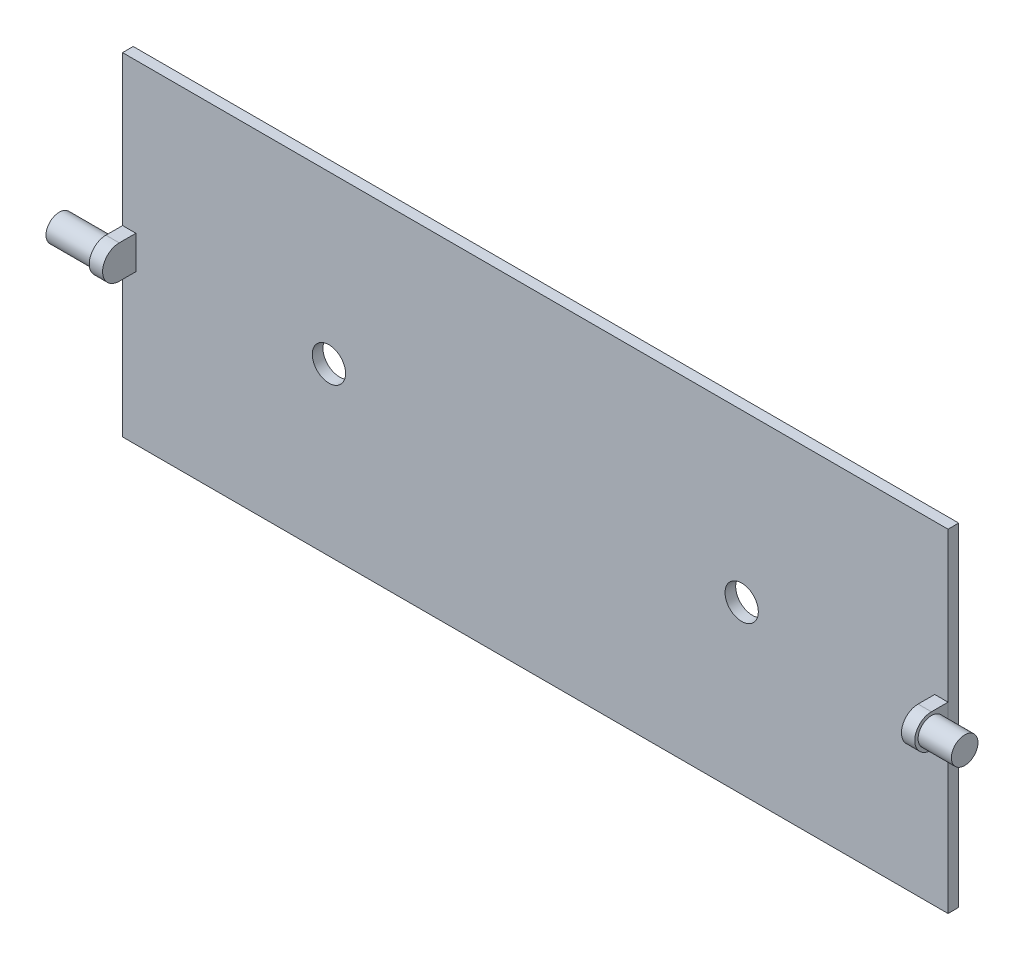
ISO-10303-21;
HEADER;
FILE_DESCRIPTION(('STEP AP214'),'2;1');
FILE_NAME('part.step','',(''),(''),'','','');
FILE_SCHEMA(('AUTOMOTIVE_DESIGN { 1 0 10303 214 1 1 1 1 }'));
ENDSEC;
DATA;
#1=APPLICATION_CONTEXT('core data for automotive mechanical design processes');
#2=APPLICATION_PROTOCOL_DEFINITION('international standard','automotive_design',2000,#1);
#3=PRODUCT_CONTEXT('',#1,'mechanical');
#4=PRODUCT('Part','Part','',(#3));
#5=PRODUCT_RELATED_PRODUCT_CATEGORY('part','',(#4));
#6=PRODUCT_DEFINITION_FORMATION('','',#4);
#7=PRODUCT_DEFINITION_CONTEXT('part definition',#1,'design');
#8=PRODUCT_DEFINITION('design','',#6,#7);
#9=PRODUCT_DEFINITION_SHAPE('','',#8);
#10=(LENGTH_UNIT() NAMED_UNIT(*) SI_UNIT(.MILLI.,.METRE.));
#11=(NAMED_UNIT(*) PLANE_ANGLE_UNIT() SI_UNIT($,.RADIAN.));
#12=(NAMED_UNIT(*) SI_UNIT($,.STERADIAN.) SOLID_ANGLE_UNIT());
#13=UNCERTAINTY_MEASURE_WITH_UNIT(LENGTH_MEASURE(1.E-05),#10,'distance_accuracy_value','');
#14=(GEOMETRIC_REPRESENTATION_CONTEXT(3) GLOBAL_UNCERTAINTY_ASSIGNED_CONTEXT((#13)) GLOBAL_UNIT_ASSIGNED_CONTEXT((#10,
#11,#12)) REPRESENTATION_CONTEXT('',''));
#15=CARTESIAN_POINT('',(0.,0.,0.));
#16=DIRECTION('',(0.,0.,1.));
#17=DIRECTION('',(1.,0.,0.));
#18=AXIS2_PLACEMENT_3D('',#15,#16,#17);
#19=CARTESIAN_POINT('',(-345.,0.,20.5));
#20=DIRECTION('',(1.,0.,0.));
#21=DIRECTION('',(0.,0.,-1.));
#22=AXIS2_PLACEMENT_3D('',#19,#20,#21);
#23=CYLINDRICAL_SURFACE('',#22,10.);
#24=CARTESIAN_POINT('',(-345.,0.,20.5));
#25=DIRECTION('',(-1.,0.,0.));
#26=DIRECTION('',(0.,0.,1.));
#27=AXIS2_PLACEMENT_3D('',#24,#25,#26);
#28=CIRCLE('',#27,10.);
#29=CARTESIAN_POINT('',(-345.,0.,30.5));
#30=VERTEX_POINT('',#29);
#31=EDGE_CURVE('E11',#30,#30,#28,.T.);
#32=ORIENTED_EDGE('',*,*,#31,.F.);
#33=EDGE_LOOP('',(#32));
#34=FACE_BOUND('',#33,.T.);
#35=CARTESIAN_POINT('',(-310.,0.,20.5));
#36=DIRECTION('',(-1.,0.,0.));
#37=DIRECTION('',(0.,0.,1.));
#38=AXIS2_PLACEMENT_3D('',#35,#36,#37);
#39=CIRCLE('',#38,10.);
#40=CARTESIAN_POINT('',(-310.,0.,30.5));
#41=VERTEX_POINT('',#40);
#42=EDGE_CURVE('E42',#41,#41,#39,.T.);
#43=ORIENTED_EDGE('',*,*,#42,.T.);
#44=EDGE_LOOP('',(#43));
#45=FACE_BOUND('',#44,.T.);
#46=ADVANCED_FACE('F39',(#34,#45),#23,.T.);
#47=CARTESIAN_POINT('',(-345.,0.,20.5));
#48=DIRECTION('',(-1.,0.,0.));
#49=DIRECTION('',(0.,0.,1.));
#50=AXIS2_PLACEMENT_3D('',#47,#48,#49);
#51=PLANE('',#50);
#52=ORIENTED_EDGE('',*,*,#31,.T.);
#53=EDGE_LOOP('',(#52));
#54=FACE_BOUND('',#53,.T.);
#55=ADVANCED_FACE('F54',(#54),#51,.T.);
#56=CARTESIAN_POINT('',(-310.,0.,20.5));
#57=DIRECTION('',(-1.,0.,0.));
#58=DIRECTION('',(0.,0.,1.));
#59=AXIS2_PLACEMENT_3D('',#56,#57,#58);
#60=PLANE('',#59);
#61=ORIENTED_EDGE('',*,*,#42,.F.);
#62=EDGE_LOOP('',(#61));
#63=FACE_BOUND('',#62,.T.);
#64=ADVANCED_FACE('F52',(#63),#60,.F.);
#65=CLOSED_SHELL('',(#46,#55,#64));
#66=MANIFOLD_SOLID_BREP('B2',#65);
#67=CARTESIAN_POINT('',(335.,0.,20.5));
#68=DIRECTION('',(-1.,0.,0.));
#69=DIRECTION('',(0.,0.,1.));
#70=AXIS2_PLACEMENT_3D('',#67,#68,#69);
#71=CYLINDRICAL_SURFACE('',#70,10.);
#72=CARTESIAN_POINT('',(335.,0.,20.5));
#73=DIRECTION('',(1.,0.,0.));
#74=DIRECTION('',(0.,0.,-1.));
#75=AXIS2_PLACEMENT_3D('',#72,#73,#74);
#76=CIRCLE('',#75,10.);
#77=CARTESIAN_POINT('',(335.,0.,10.5));
#78=VERTEX_POINT('',#77);
#79=EDGE_CURVE('E38',#78,#78,#76,.T.);
#80=ORIENTED_EDGE('',*,*,#79,.F.);
#81=EDGE_LOOP('',(#80));
#82=FACE_BOUND('',#81,.T.);
#83=CARTESIAN_POINT('',(310.,0.,20.5));
#84=DIRECTION('',(1.,0.,0.));
#85=DIRECTION('',(0.,0.,-1.));
#86=AXIS2_PLACEMENT_3D('',#83,#84,#85);
#87=CIRCLE('',#86,10.);
#88=CARTESIAN_POINT('',(310.,0.,10.5));
#89=VERTEX_POINT('',#88);
#90=EDGE_CURVE('E92',#89,#89,#87,.T.);
#91=ORIENTED_EDGE('',*,*,#90,.T.);
#92=EDGE_LOOP('',(#91));
#93=FACE_BOUND('',#92,.T.);
#94=ADVANCED_FACE('F89',(#82,#93),#71,.T.);
#95=CARTESIAN_POINT('',(335.,0.,20.5));
#96=DIRECTION('',(1.,0.,0.));
#97=DIRECTION('',(0.,0.,-1.));
#98=AXIS2_PLACEMENT_3D('',#95,#96,#97);
#99=PLANE('',#98);
#100=ORIENTED_EDGE('',*,*,#79,.T.);
#101=EDGE_LOOP('',(#100));
#102=FACE_BOUND('',#101,.T.);
#103=ADVANCED_FACE('F104',(#102),#99,.T.);
#104=CARTESIAN_POINT('',(310.,0.,20.5));
#105=DIRECTION('',(1.,0.,0.));
#106=DIRECTION('',(0.,0.,-1.));
#107=AXIS2_PLACEMENT_3D('',#104,#105,#106);
#108=PLANE('',#107);
#109=ORIENTED_EDGE('',*,*,#90,.F.);
#110=EDGE_LOOP('',(#109));
#111=FACE_BOUND('',#110,.T.);
#112=ADVANCED_FACE('F102',(#111),#108,.F.);
#113=CLOSED_SHELL('',(#94,#103,#112));
#114=MANIFOLD_SOLID_BREP('B6',#113);
#115=CARTESIAN_POINT('',(300.,12.5,8.));
#116=DIRECTION('',(0.,0.,1.));
#117=DIRECTION('',(1.,0.,0.));
#118=AXIS2_PLACEMENT_3D('',#115,#116,#117);
#119=PLANE('',#118);
#120=DIRECTION('',(0.,-1.,0.));
#121=VECTOR('',#120,1.);
#122=CARTESIAN_POINT('',(310.,12.5,8.));
#123=LINE('',#122,#121);
#124=CARTESIAN_POINT('',(310.,12.5,8.));
#125=VERTEX_POINT('',#124);
#126=CARTESIAN_POINT('',(310.,-12.5,8.));
#127=VERTEX_POINT('',#126);
#128=EDGE_CURVE('E200',#125,#127,#123,.T.);
#129=ORIENTED_EDGE('',*,*,#128,.T.);
#130=DIRECTION('',(1.,0.,0.));
#131=VECTOR('',#130,1.);
#132=CARTESIAN_POINT('',(300.,-12.5,8.));
#133=LINE('',#132,#131);
#134=CARTESIAN_POINT('',(300.,-12.5,8.));
#135=VERTEX_POINT('',#134);
#136=EDGE_CURVE('E87',#135,#127,#133,.T.);
#137=ORIENTED_EDGE('',*,*,#136,.F.);
#138=DIRECTION('',(0.,-1.,0.));
#139=VECTOR('',#138,1.);
#140=CARTESIAN_POINT('',(300.,12.5,8.));
#141=LINE('',#140,#139);
#142=CARTESIAN_POINT('',(300.,12.5,8.));
#143=VERTEX_POINT('',#142);
#144=EDGE_CURVE('E185',#143,#135,#141,.T.);
#145=ORIENTED_EDGE('',*,*,#144,.F.);
#146=DIRECTION('',(1.,0.,0.));
#147=VECTOR('',#146,1.);
#148=CARTESIAN_POINT('',(300.,12.5,8.));
#149=LINE('',#148,#147);
#150=EDGE_CURVE('E196',#143,#125,#149,.T.);
#151=ORIENTED_EDGE('',*,*,#150,.T.);
#152=EDGE_LOOP('',(#129,#137,#145,#151));
#153=FACE_BOUND('',#152,.T.);
#154=ADVANCED_FACE('F138',(#153),#119,.F.);
#155=CARTESIAN_POINT('',(300.,-12.5,8.));
#156=DIRECTION('',(0.,1.,0.));
#157=DIRECTION('',(0.,0.,1.));
#158=AXIS2_PLACEMENT_3D('',#155,#156,#157);
#159=PLANE('',#158);
#160=DIRECTION('',(0.,0.,1.));
#161=VECTOR('',#160,1.);
#162=CARTESIAN_POINT('',(310.,-12.5,8.));
#163=LINE('',#162,#161);
#164=CARTESIAN_POINT('',(310.,-12.5,20.5));
#165=VERTEX_POINT('',#164);
#166=EDGE_CURVE('E190',#127,#165,#163,.T.);
#167=ORIENTED_EDGE('',*,*,#166,.T.);
#168=DIRECTION('',(1.,0.,0.));
#169=VECTOR('',#168,1.);
#170=CARTESIAN_POINT('',(300.,-12.5,20.5));
#171=LINE('',#170,#169);
#172=CARTESIAN_POINT('',(300.,-12.5,20.5));
#173=VERTEX_POINT('',#172);
#174=EDGE_CURVE('E146',#173,#165,#171,.T.);
#175=ORIENTED_EDGE('',*,*,#174,.F.);
#176=DIRECTION('',(0.,0.,1.));
#177=VECTOR('',#176,1.);
#178=CARTESIAN_POINT('',(300.,-12.5,8.));
#179=LINE('',#178,#177);
#180=EDGE_CURVE('E180',#135,#173,#179,.T.);
#181=ORIENTED_EDGE('',*,*,#180,.F.);
#182=ORIENTED_EDGE('',*,*,#136,.T.);
#183=EDGE_LOOP('',(#167,#175,#181,#182));
#184=FACE_BOUND('',#183,.T.);
#185=ADVANCED_FACE('F189',(#184),#159,.F.);
#186=CARTESIAN_POINT('',(300.,0.,20.5));
#187=DIRECTION('',(1.,0.,0.));
#188=DIRECTION('',(0.,0.,-1.));
#189=AXIS2_PLACEMENT_3D('',#186,#187,#188);
#190=CYLINDRICAL_SURFACE('',#189,12.5);
#191=CARTESIAN_POINT('',(310.,0.,20.5));
#192=DIRECTION('',(1.,0.,0.));
#193=DIRECTION('',(0.,0.,-1.));
#194=AXIS2_PLACEMENT_3D('',#191,#192,#193);
#195=CIRCLE('',#194,12.5);
#196=CARTESIAN_POINT('',(310.,12.5,20.5));
#197=VERTEX_POINT('',#196);
#198=EDGE_CURVE('E204',#197,#165,#195,.T.);
#199=ORIENTED_EDGE('',*,*,#198,.F.);
#200=DIRECTION('',(1.,0.,0.));
#201=VECTOR('',#200,1.);
#202=CARTESIAN_POINT('',(300.,12.5,20.5));
#203=LINE('',#202,#201);
#204=CARTESIAN_POINT('',(300.,12.5,20.5));
#205=VERTEX_POINT('',#204);
#206=EDGE_CURVE('E170',#205,#197,#203,.T.);
#207=ORIENTED_EDGE('',*,*,#206,.F.);
#208=CARTESIAN_POINT('',(300.,0.,20.5));
#209=DIRECTION('',(1.,0.,0.));
#210=DIRECTION('',(0.,0.,-1.));
#211=AXIS2_PLACEMENT_3D('',#208,#209,#210);
#212=CIRCLE('',#211,12.5);
#213=EDGE_CURVE('E183',#205,#173,#212,.T.);
#214=ORIENTED_EDGE('',*,*,#213,.T.);
#215=ORIENTED_EDGE('',*,*,#174,.T.);
#216=EDGE_LOOP('',(#199,#207,#214,#215));
#217=FACE_BOUND('',#216,.T.);
#218=ADVANCED_FACE('F194',(#217),#190,.T.);
#219=CARTESIAN_POINT('',(300.,12.5,20.5));
#220=DIRECTION('',(0.,-1.,0.));
#221=DIRECTION('',(0.,0.,-1.));
#222=AXIS2_PLACEMENT_3D('',#219,#220,#221);
#223=PLANE('',#222);
#224=DIRECTION('',(0.,0.,-1.));
#225=VECTOR('',#224,1.);
#226=CARTESIAN_POINT('',(310.,12.5,20.5));
#227=LINE('',#226,#225);
#228=EDGE_CURVE('E173',#197,#125,#227,.T.);
#229=ORIENTED_EDGE('',*,*,#228,.T.);
#230=ORIENTED_EDGE('',*,*,#150,.F.);
#231=DIRECTION('',(0.,0.,-1.));
#232=VECTOR('',#231,1.);
#233=CARTESIAN_POINT('',(300.,12.5,20.5));
#234=LINE('',#233,#232);
#235=EDGE_CURVE('E154',#205,#143,#234,.T.);
#236=ORIENTED_EDGE('',*,*,#235,.F.);
#237=ORIENTED_EDGE('',*,*,#206,.T.);
#238=EDGE_LOOP('',(#229,#230,#236,#237));
#239=FACE_BOUND('',#238,.T.);
#240=ADVANCED_FACE('F217',(#239),#223,.F.);
#241=CARTESIAN_POINT('',(300.,0.,20.5));
#242=DIRECTION('',(1.,0.,0.));
#243=DIRECTION('',(0.,0.,-1.));
#244=AXIS2_PLACEMENT_3D('',#241,#242,#243);
#245=PLANE('',#244);
#246=ORIENTED_EDGE('',*,*,#144,.T.);
#247=ORIENTED_EDGE('',*,*,#180,.T.);
#248=ORIENTED_EDGE('',*,*,#213,.F.);
#249=ORIENTED_EDGE('',*,*,#235,.T.);
#250=EDGE_LOOP('',(#246,#247,#248,#249));
#251=FACE_BOUND('',#250,.T.);
#252=ADVANCED_FACE('F181',(#251),#245,.F.);
#253=CARTESIAN_POINT('',(310.,0.,20.5));
#254=DIRECTION('',(1.,0.,0.));
#255=DIRECTION('',(0.,0.,-1.));
#256=AXIS2_PLACEMENT_3D('',#253,#254,#255);
#257=PLANE('',#256);
#258=ORIENTED_EDGE('',*,*,#128,.F.);
#259=ORIENTED_EDGE('',*,*,#228,.F.);
#260=ORIENTED_EDGE('',*,*,#198,.T.);
#261=ORIENTED_EDGE('',*,*,#166,.F.);
#262=EDGE_LOOP('',(#258,#259,#260,#261));
#263=FACE_BOUND('',#262,.T.);
#264=ADVANCED_FACE('F211',(#263),#257,.T.);
#265=CLOSED_SHELL('',(#154,#185,#218,#240,#252,#264));
#266=MANIFOLD_SOLID_BREP('B33',#265);
#267=CARTESIAN_POINT('',(0.,0.,8.));
#268=DIRECTION('',(0.,0.,-1.));
#269=DIRECTION('',(-1.,0.,0.));
#270=AXIS2_PLACEMENT_3D('',#267,#268,#269);
#271=PLANE('',#270);
#272=CARTESIAN_POINT('',(155.,0.,8.));
#273=DIRECTION('',(0.,0.,1.));
#274=DIRECTION('',(1.,0.,0.));
#275=AXIS2_PLACEMENT_3D('',#272,#273,#274);
#276=CIRCLE('',#275,12.5);
#277=CARTESIAN_POINT('',(167.5,0.,8.));
#278=VERTEX_POINT('',#277);
#279=EDGE_CURVE('E373',#278,#278,#276,.T.);
#280=ORIENTED_EDGE('',*,*,#279,.F.);
#281=EDGE_LOOP('',(#280));
#282=FACE_BOUND('',#281,.T.);
#283=CARTESIAN_POINT('',(-155.,0.,8.));
#284=DIRECTION('',(0.,0.,1.));
#285=DIRECTION('',(-1.,0.,0.));
#286=AXIS2_PLACEMENT_3D('',#283,#284,#285);
#287=CIRCLE('',#286,12.5);
#288=CARTESIAN_POINT('',(-167.5,0.,8.));
#289=VERTEX_POINT('',#288);
#290=EDGE_CURVE('E369',#289,#289,#287,.T.);
#291=ORIENTED_EDGE('',*,*,#290,.F.);
#292=EDGE_LOOP('',(#291));
#293=FACE_BOUND('',#292,.T.);
#294=DIRECTION('',(-1.,0.,0.));
#295=VECTOR('',#294,1.);
#296=CARTESIAN_POINT('',(-300.,12.5,8.));
#297=LINE('',#296,#295);
#298=CARTESIAN_POINT('',(-300.,12.5,8.));
#299=VERTEX_POINT('',#298);
#300=CARTESIAN_POINT('',(-310.,12.5,8.));
#301=VERTEX_POINT('',#300);
#302=EDGE_CURVE('E354',#299,#301,#297,.T.);
#303=ORIENTED_EDGE('',*,*,#302,.F.);
#304=DIRECTION('',(0.,-1.,0.));
#305=VECTOR('',#304,1.);
#306=CARTESIAN_POINT('',(-300.,12.5,8.));
#307=LINE('',#306,#305);
#308=CARTESIAN_POINT('',(-300.,-12.5,8.));
#309=VERTEX_POINT('',#308);
#310=EDGE_CURVE('E340',#299,#309,#307,.T.);
#311=ORIENTED_EDGE('',*,*,#310,.T.);
#312=DIRECTION('',(-1.,0.,0.));
#313=VECTOR('',#312,1.);
#314=CARTESIAN_POINT('',(-300.,-12.5,8.));
#315=LINE('',#314,#313);
#316=CARTESIAN_POINT('',(-310.,-12.5,8.));
#317=VERTEX_POINT('',#316);
#318=EDGE_CURVE('E348',#309,#317,#315,.T.);
#319=ORIENTED_EDGE('',*,*,#318,.T.);
#320=DIRECTION('',(0.,-1.,0.));
#321=VECTOR('',#320,1.);
#322=CARTESIAN_POINT('',(-310.,-125.,8.));
#323=LINE('',#322,#321);
#324=CARTESIAN_POINT('',(-310.,-125.,8.));
#325=VERTEX_POINT('',#324);
#326=EDGE_CURVE('E385',#317,#325,#323,.T.);
#327=ORIENTED_EDGE('',*,*,#326,.T.);
#328=DIRECTION('',(1.,0.,0.));
#329=VECTOR('',#328,1.);
#330=CARTESIAN_POINT('',(-310.,-125.,8.));
#331=LINE('',#330,#329);
#332=CARTESIAN_POINT('',(310.,-125.,8.));
#333=VERTEX_POINT('',#332);
#334=EDGE_CURVE('E285',#325,#333,#331,.T.);
#335=ORIENTED_EDGE('',*,*,#334,.T.);
#336=DIRECTION('',(0.,1.,0.));
#337=VECTOR('',#336,1.);
#338=CARTESIAN_POINT('',(310.,-125.,8.));
#339=LINE('',#338,#337);
#340=CARTESIAN_POINT('',(310.,125.,8.));
#341=VERTEX_POINT('',#340);
#342=EDGE_CURVE('E382',#333,#341,#339,.T.);
#343=ORIENTED_EDGE('',*,*,#342,.T.);
#344=DIRECTION('',(-1.,0.,0.));
#345=VECTOR('',#344,1.);
#346=CARTESIAN_POINT('',(-310.,125.,8.));
#347=LINE('',#346,#345);
#348=CARTESIAN_POINT('',(-310.,125.,8.));
#349=VERTEX_POINT('',#348);
#350=EDGE_CURVE('E313',#341,#349,#347,.T.);
#351=ORIENTED_EDGE('',*,*,#350,.T.);
#352=EDGE_CURVE('E386',#349,#301,#323,.T.);
#353=ORIENTED_EDGE('',*,*,#352,.T.);
#354=EDGE_LOOP('',(#303,#311,#319,#327,#335,#343,#351,#353));
#355=FACE_BOUND('',#354,.T.);
#356=ADVANCED_FACE('F261',(#282,#293,#355),#271,.F.);
#357=CARTESIAN_POINT('',(310.,-125.,8.));
#358=DIRECTION('',(-1.,0.,0.));
#359=DIRECTION('',(0.,0.,1.));
#360=AXIS2_PLACEMENT_3D('',#357,#358,#359);
#361=PLANE('',#360);
#362=DIRECTION('',(0.,1.,0.));
#363=VECTOR('',#362,1.);
#364=CARTESIAN_POINT('',(310.,-125.,0.));
#365=LINE('',#364,#363);
#366=CARTESIAN_POINT('',(310.,-125.,0.));
#367=VERTEX_POINT('',#366);
#368=CARTESIAN_POINT('',(310.,125.,0.));
#369=VERTEX_POINT('',#368);
#370=EDGE_CURVE('E379',#367,#369,#365,.T.);
#371=ORIENTED_EDGE('',*,*,#370,.T.);
#372=DIRECTION('',(0.,0.,-1.));
#373=VECTOR('',#372,1.);
#374=CARTESIAN_POINT('',(310.,125.,8.));
#375=LINE('',#374,#373);
#376=EDGE_CURVE('E136',#341,#369,#375,.T.);
#377=ORIENTED_EDGE('',*,*,#376,.F.);
#378=ORIENTED_EDGE('',*,*,#342,.F.);
#379=DIRECTION('',(0.,0.,-1.));
#380=VECTOR('',#379,1.);
#381=CARTESIAN_POINT('',(310.,-125.,8.));
#382=LINE('',#381,#380);
#383=EDGE_CURVE('E389',#333,#367,#382,.T.);
#384=ORIENTED_EDGE('',*,*,#383,.T.);
#385=EDGE_LOOP('',(#371,#377,#378,#384));
#386=FACE_BOUND('',#385,.T.);
#387=ADVANCED_FACE('F263',(#386),#361,.F.);
#388=CARTESIAN_POINT('',(-310.,125.,8.));
#389=DIRECTION('',(0.,-1.,0.));
#390=DIRECTION('',(0.,0.,-1.));
#391=AXIS2_PLACEMENT_3D('',#388,#389,#390);
#392=PLANE('',#391);
#393=DIRECTION('',(-1.,0.,0.));
#394=VECTOR('',#393,1.);
#395=CARTESIAN_POINT('',(-310.,125.,0.));
#396=LINE('',#395,#394);
#397=CARTESIAN_POINT('',(-310.,125.,0.));
#398=VERTEX_POINT('',#397);
#399=EDGE_CURVE('E392',#369,#398,#396,.T.);
#400=ORIENTED_EDGE('',*,*,#399,.T.);
#401=DIRECTION('',(0.,0.,-1.));
#402=VECTOR('',#401,1.);
#403=CARTESIAN_POINT('',(-310.,125.,8.));
#404=LINE('',#403,#402);
#405=EDGE_CURVE('E269',#349,#398,#404,.T.);
#406=ORIENTED_EDGE('',*,*,#405,.F.);
#407=ORIENTED_EDGE('',*,*,#350,.F.);
#408=ORIENTED_EDGE('',*,*,#376,.T.);
#409=EDGE_LOOP('',(#400,#406,#407,#408));
#410=FACE_BOUND('',#409,.T.);
#411=ADVANCED_FACE('F432',(#410),#392,.F.);
#412=CARTESIAN_POINT('',(-310.,-125.,8.));
#413=DIRECTION('',(1.,0.,0.));
#414=DIRECTION('',(0.,0.,-1.));
#415=AXIS2_PLACEMENT_3D('',#412,#413,#414);
#416=PLANE('',#415);
#417=DIRECTION('',(0.,-1.,0.));
#418=VECTOR('',#417,1.);
#419=CARTESIAN_POINT('',(-310.,-125.,0.));
#420=LINE('',#419,#418);
#421=CARTESIAN_POINT('',(-310.,-125.,0.));
#422=VERTEX_POINT('',#421);
#423=EDGE_CURVE('E394',#398,#422,#420,.T.);
#424=ORIENTED_EDGE('',*,*,#423,.T.);
#425=DIRECTION('',(0.,0.,-1.));
#426=VECTOR('',#425,1.);
#427=CARTESIAN_POINT('',(-310.,-125.,8.));
#428=LINE('',#427,#426);
#429=EDGE_CURVE('E398',#325,#422,#428,.T.);
#430=ORIENTED_EDGE('',*,*,#429,.F.);
#431=ORIENTED_EDGE('',*,*,#326,.F.);
#432=DIRECTION('',(0.,0.,1.));
#433=VECTOR('',#432,1.);
#434=CARTESIAN_POINT('',(-310.,-12.5,8.));
#435=LINE('',#434,#433);
#436=CARTESIAN_POINT('',(-310.,-12.5,20.5));
#437=VERTEX_POINT('',#436);
#438=EDGE_CURVE('E276',#317,#437,#435,.T.);
#439=ORIENTED_EDGE('',*,*,#438,.T.);
#440=CARTESIAN_POINT('',(-310.,0.,20.5));
#441=DIRECTION('',(1.,0.,0.));
#442=DIRECTION('',(0.,0.,-1.));
#443=AXIS2_PLACEMENT_3D('',#440,#441,#442);
#444=CIRCLE('',#443,12.5);
#445=CARTESIAN_POINT('',(-310.,12.5,20.5));
#446=VERTEX_POINT('',#445);
#447=EDGE_CURVE('E345',#446,#437,#444,.T.);
#448=ORIENTED_EDGE('',*,*,#447,.F.);
#449=DIRECTION('',(0.,0.,-1.));
#450=VECTOR('',#449,1.);
#451=CARTESIAN_POINT('',(-310.,12.5,20.5));
#452=LINE('',#451,#450);
#453=EDGE_CURVE('E365',#446,#301,#452,.T.);
#454=ORIENTED_EDGE('',*,*,#453,.T.);
#455=ORIENTED_EDGE('',*,*,#352,.F.);
#456=ORIENTED_EDGE('',*,*,#405,.T.);
#457=EDGE_LOOP('',(#424,#430,#431,#439,#448,#454,#455,#456));
#458=FACE_BOUND('',#457,.T.);
#459=ADVANCED_FACE('F403',(#458),#416,.F.);
#460=CARTESIAN_POINT('',(-310.,-125.,8.));
#461=DIRECTION('',(0.,1.,0.));
#462=DIRECTION('',(0.,0.,1.));
#463=AXIS2_PLACEMENT_3D('',#460,#461,#462);
#464=PLANE('',#463);
#465=DIRECTION('',(1.,0.,0.));
#466=VECTOR('',#465,1.);
#467=CARTESIAN_POINT('',(-310.,-125.,0.));
#468=LINE('',#467,#466);
#469=EDGE_CURVE('E306',#422,#367,#468,.T.);
#470=ORIENTED_EDGE('',*,*,#469,.T.);
#471=ORIENTED_EDGE('',*,*,#383,.F.);
#472=ORIENTED_EDGE('',*,*,#334,.F.);
#473=ORIENTED_EDGE('',*,*,#429,.T.);
#474=EDGE_LOOP('',(#470,#471,#472,#473));
#475=FACE_BOUND('',#474,.T.);
#476=ADVANCED_FACE('F411',(#475),#464,.F.);
#477=CARTESIAN_POINT('',(0.,0.,0.));
#478=DIRECTION('',(0.,0.,-1.));
#479=DIRECTION('',(-1.,0.,0.));
#480=AXIS2_PLACEMENT_3D('',#477,#478,#479);
#481=PLANE('',#480);
#482=CARTESIAN_POINT('',(-155.,0.,0.));
#483=DIRECTION('',(0.,0.,1.));
#484=DIRECTION('',(-1.,0.,0.));
#485=AXIS2_PLACEMENT_3D('',#482,#483,#484);
#486=CIRCLE('',#485,12.5);
#487=CARTESIAN_POINT('',(-167.5,0.,0.));
#488=VERTEX_POINT('',#487);
#489=EDGE_CURVE('E370',#488,#488,#486,.T.);
#490=ORIENTED_EDGE('',*,*,#489,.T.);
#491=EDGE_LOOP('',(#490));
#492=FACE_BOUND('',#491,.T.);
#493=CARTESIAN_POINT('',(155.,0.,0.));
#494=DIRECTION('',(0.,0.,1.));
#495=DIRECTION('',(1.,0.,0.));
#496=AXIS2_PLACEMENT_3D('',#493,#494,#495);
#497=CIRCLE('',#496,12.5);
#498=CARTESIAN_POINT('',(167.5,0.,0.));
#499=VERTEX_POINT('',#498);
#500=EDGE_CURVE('E376',#499,#499,#497,.T.);
#501=ORIENTED_EDGE('',*,*,#500,.T.);
#502=EDGE_LOOP('',(#501));
#503=FACE_BOUND('',#502,.T.);
#504=ORIENTED_EDGE('',*,*,#370,.F.);
#505=ORIENTED_EDGE('',*,*,#469,.F.);
#506=ORIENTED_EDGE('',*,*,#423,.F.);
#507=ORIENTED_EDGE('',*,*,#399,.F.);
#508=EDGE_LOOP('',(#504,#505,#506,#507));
#509=FACE_BOUND('',#508,.T.);
#510=ADVANCED_FACE('F407',(#492,#503,#509),#481,.T.);
#511=CARTESIAN_POINT('',(155.,0.,0.));
#512=DIRECTION('',(0.,0.,1.));
#513=DIRECTION('',(1.,0.,0.));
#514=AXIS2_PLACEMENT_3D('',#511,#512,#513);
#515=CYLINDRICAL_SURFACE('',#514,12.5);
#516=ORIENTED_EDGE('',*,*,#500,.F.);
#517=EDGE_LOOP('',(#516));
#518=FACE_BOUND('',#517,.T.);
#519=ORIENTED_EDGE('',*,*,#279,.T.);
#520=EDGE_LOOP('',(#519));
#521=FACE_BOUND('',#520,.T.);
#522=ADVANCED_FACE('F437',(#518,#521),#515,.F.);
#523=CARTESIAN_POINT('',(-155.,0.,0.));
#524=DIRECTION('',(0.,0.,1.));
#525=DIRECTION('',(1.,0.,0.));
#526=AXIS2_PLACEMENT_3D('',#523,#524,#525);
#527=CYLINDRICAL_SURFACE('',#526,12.5);
#528=ORIENTED_EDGE('',*,*,#489,.F.);
#529=EDGE_LOOP('',(#528));
#530=FACE_BOUND('',#529,.T.);
#531=ORIENTED_EDGE('',*,*,#290,.T.);
#532=EDGE_LOOP('',(#531));
#533=FACE_BOUND('',#532,.T.);
#534=ADVANCED_FACE('F469',(#530,#533),#527,.F.);
#535=CARTESIAN_POINT('',(-300.,-12.5,8.));
#536=DIRECTION('',(0.,1.,0.));
#537=DIRECTION('',(0.,0.,1.));
#538=AXIS2_PLACEMENT_3D('',#535,#536,#537);
#539=PLANE('',#538);
#540=ORIENTED_EDGE('',*,*,#438,.F.);
#541=ORIENTED_EDGE('',*,*,#318,.F.);
#542=DIRECTION('',(0.,0.,1.));
#543=VECTOR('',#542,1.);
#544=CARTESIAN_POINT('',(-300.,-12.5,8.));
#545=LINE('',#544,#543);
#546=CARTESIAN_POINT('',(-300.,-12.5,20.5));
#547=VERTEX_POINT('',#546);
#548=EDGE_CURVE('E337',#309,#547,#545,.T.);
#549=ORIENTED_EDGE('',*,*,#548,.T.);
#550=DIRECTION('',(-1.,0.,0.));
#551=VECTOR('',#550,1.);
#552=CARTESIAN_POINT('',(-300.,-12.5,20.5));
#553=LINE('',#552,#551);
#554=EDGE_CURVE('E346',#547,#437,#553,.T.);
#555=ORIENTED_EDGE('',*,*,#554,.T.);
#556=EDGE_LOOP('',(#540,#541,#549,#555));
#557=FACE_BOUND('',#556,.T.);
#558=ADVANCED_FACE('F349',(#557),#539,.F.);
#559=CARTESIAN_POINT('',(-300.,0.,20.5));
#560=DIRECTION('',(-1.,0.,0.));
#561=DIRECTION('',(0.,0.,-1.));
#562=AXIS2_PLACEMENT_3D('',#559,#560,#561);
#563=CYLINDRICAL_SURFACE('',#562,12.5);
#564=ORIENTED_EDGE('',*,*,#447,.T.);
#565=ORIENTED_EDGE('',*,*,#554,.F.);
#566=CARTESIAN_POINT('',(-300.,0.,20.5));
#567=DIRECTION('',(1.,0.,0.));
#568=DIRECTION('',(0.,0.,-1.));
#569=AXIS2_PLACEMENT_3D('',#566,#567,#568);
#570=CIRCLE('',#569,12.5);
#571=CARTESIAN_POINT('',(-300.,12.5,20.5));
#572=VERTEX_POINT('',#571);
#573=EDGE_CURVE('E343',#572,#547,#570,.T.);
#574=ORIENTED_EDGE('',*,*,#573,.F.);
#575=DIRECTION('',(-1.,0.,0.));
#576=VECTOR('',#575,1.);
#577=CARTESIAN_POINT('',(-300.,12.5,20.5));
#578=LINE('',#577,#576);
#579=EDGE_CURVE('E361',#572,#446,#578,.T.);
#580=ORIENTED_EDGE('',*,*,#579,.T.);
#581=EDGE_LOOP('',(#564,#565,#574,#580));
#582=FACE_BOUND('',#581,.T.);
#583=ADVANCED_FACE('F414',(#582),#563,.T.);
#584=CARTESIAN_POINT('',(-300.,12.5,20.5));
#585=DIRECTION('',(0.,-1.,0.));
#586=DIRECTION('',(0.,0.,-1.));
#587=AXIS2_PLACEMENT_3D('',#584,#585,#586);
#588=PLANE('',#587);
#589=ORIENTED_EDGE('',*,*,#453,.F.);
#590=ORIENTED_EDGE('',*,*,#579,.F.);
#591=DIRECTION('',(0.,0.,-1.));
#592=VECTOR('',#591,1.);
#593=CARTESIAN_POINT('',(-300.,12.5,20.5));
#594=LINE('',#593,#592);
#595=EDGE_CURVE('E367',#572,#299,#594,.T.);
#596=ORIENTED_EDGE('',*,*,#595,.T.);
#597=ORIENTED_EDGE('',*,*,#302,.T.);
#598=EDGE_LOOP('',(#589,#590,#596,#597));
#599=FACE_BOUND('',#598,.T.);
#600=ADVANCED_FACE('F417',(#599),#588,.F.);
#601=CARTESIAN_POINT('',(-300.,0.,20.5));
#602=DIRECTION('',(-1.,0.,0.));
#603=DIRECTION('',(0.,0.,-1.));
#604=AXIS2_PLACEMENT_3D('',#601,#602,#603);
#605=PLANE('',#604);
#606=ORIENTED_EDGE('',*,*,#310,.F.);
#607=ORIENTED_EDGE('',*,*,#595,.F.);
#608=ORIENTED_EDGE('',*,*,#573,.T.);
#609=ORIENTED_EDGE('',*,*,#548,.F.);
#610=EDGE_LOOP('',(#606,#607,#608,#609));
#611=FACE_BOUND('',#610,.T.);
#612=ADVANCED_FACE('F338',(#611),#605,.F.);
#613=CLOSED_SHELL('',(#356,#387,#411,#459,#476,#510,#522,#534,#558,#583,#600,#612));
#614=MANIFOLD_SOLID_BREP('B81',#613);
#615=ADVANCED_BREP_SHAPE_REPRESENTATION('',(#18,#66,#114,#266,#614),#14);
#616=SHAPE_DEFINITION_REPRESENTATION(#9,#615);
ENDSEC;
END-ISO-10303-21;
